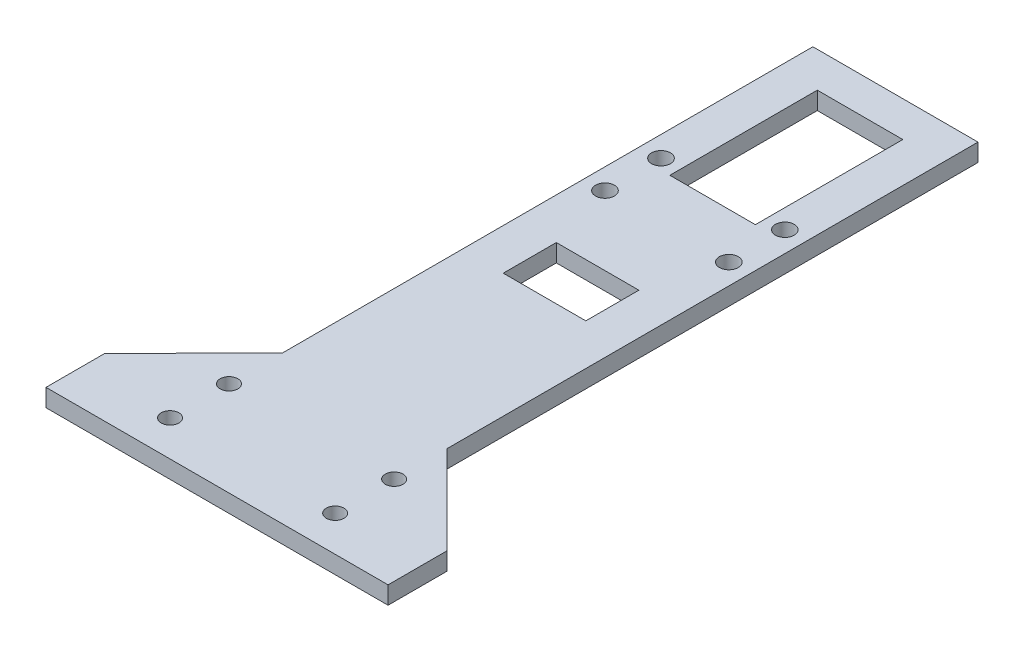
ISO-10303-21;
HEADER;
FILE_DESCRIPTION(('STEP AP214'),'2;1');
FILE_NAME('part.step','',(''),(''),'','','');
FILE_SCHEMA(('AUTOMOTIVE_DESIGN { 1 0 10303 214 1 1 1 1 }'));
ENDSEC;
DATA;
#1=APPLICATION_CONTEXT('core data for automotive mechanical design processes');
#2=APPLICATION_PROTOCOL_DEFINITION('international standard','automotive_design',2000,#1);
#3=PRODUCT_CONTEXT('',#1,'mechanical');
#4=PRODUCT('Part','Part','',(#3));
#5=PRODUCT_RELATED_PRODUCT_CATEGORY('part','',(#4));
#6=PRODUCT_DEFINITION_FORMATION('','',#4);
#7=PRODUCT_DEFINITION_CONTEXT('part definition',#1,'design');
#8=PRODUCT_DEFINITION('design','',#6,#7);
#9=PRODUCT_DEFINITION_SHAPE('','',#8);
#10=(LENGTH_UNIT() NAMED_UNIT(*) SI_UNIT(.MILLI.,.METRE.));
#11=(NAMED_UNIT(*) PLANE_ANGLE_UNIT() SI_UNIT($,.RADIAN.));
#12=(NAMED_UNIT(*) SI_UNIT($,.STERADIAN.) SOLID_ANGLE_UNIT());
#13=UNCERTAINTY_MEASURE_WITH_UNIT(LENGTH_MEASURE(1.E-05),#10,'distance_accuracy_value','');
#14=(GEOMETRIC_REPRESENTATION_CONTEXT(3) GLOBAL_UNCERTAINTY_ASSIGNED_CONTEXT((#13)) GLOBAL_UNIT_ASSIGNED_CONTEXT((#10,
#11,#12)) REPRESENTATION_CONTEXT('',''));
#15=CARTESIAN_POINT('',(0.,0.,0.));
#16=DIRECTION('',(0.,0.,1.));
#17=DIRECTION('',(1.,0.,0.));
#18=AXIS2_PLACEMENT_3D('',#15,#16,#17);
#19=CARTESIAN_POINT('',(0.,3.,0.));
#20=DIRECTION('',(0.,-1.,0.));
#21=DIRECTION('',(0.,0.,-1.));
#22=AXIS2_PLACEMENT_3D('',#19,#20,#21);
#23=PLANE('',#22);
#24=CARTESIAN_POINT('',(-24.5,3.,29.25));
#25=DIRECTION('',(0.,1.,0.));
#26=DIRECTION('',(0.,0.,-1.));
#27=AXIS2_PLACEMENT_3D('',#24,#25,#26);
#28=CIRCLE('',#27,1.6);
#29=CARTESIAN_POINT('',(-24.5,3.,27.65));
#30=VERTEX_POINT('',#29);
#31=EDGE_CURVE('E208',#30,#30,#28,.T.);
#32=ORIENTED_EDGE('',*,*,#31,.F.);
#33=EDGE_LOOP('',(#32));
#34=FACE_BOUND('',#33,.T.);
#35=CARTESIAN_POINT('',(-3.49999999999998,3.,29.25));
#36=DIRECTION('',(0.,1.,0.));
#37=DIRECTION('',(0.,0.,1.));
#38=AXIS2_PLACEMENT_3D('',#35,#36,#37);
#39=CIRCLE('',#38,1.6);
#40=CARTESIAN_POINT('',(-3.49999999999998,3.,30.85));
#41=VERTEX_POINT('',#40);
#42=EDGE_CURVE('E216',#41,#41,#39,.T.);
#43=ORIENTED_EDGE('',*,*,#42,.F.);
#44=EDGE_LOOP('',(#43));
#45=FACE_BOUND('',#44,.T.);
#46=CARTESIAN_POINT('',(-3.49999999999998,3.,38.75));
#47=DIRECTION('',(0.,1.,0.));
#48=DIRECTION('',(0.,0.,-1.));
#49=AXIS2_PLACEMENT_3D('',#46,#47,#48);
#50=CIRCLE('',#49,1.6);
#51=CARTESIAN_POINT('',(-3.49999999999998,3.,37.15));
#52=VERTEX_POINT('',#51);
#53=EDGE_CURVE('E224',#52,#52,#50,.T.);
#54=ORIENTED_EDGE('',*,*,#53,.F.);
#55=EDGE_LOOP('',(#54));
#56=FACE_BOUND('',#55,.T.);
#57=CARTESIAN_POINT('',(-24.5,3.,38.75));
#58=DIRECTION('',(0.,1.,0.));
#59=DIRECTION('',(0.,0.,1.));
#60=AXIS2_PLACEMENT_3D('',#57,#58,#59);
#61=CIRCLE('',#60,1.6);
#62=CARTESIAN_POINT('',(-24.5,3.,40.35));
#63=VERTEX_POINT('',#62);
#64=EDGE_CURVE('E232',#63,#63,#61,.T.);
#65=ORIENTED_EDGE('',*,*,#64,.F.);
#66=EDGE_LOOP('',(#65));
#67=FACE_BOUND('',#66,.T.);
#68=DIRECTION('',(0.,0.,1.));
#69=VECTOR('',#68,1.);
#70=CARTESIAN_POINT('',(-21.,3.,50.5));
#71=LINE('',#70,#69);
#72=CARTESIAN_POINT('',(-21.,3.,50.5));
#73=VERTEX_POINT('',#72);
#74=CARTESIAN_POINT('',(-21.,3.,59.5));
#75=VERTEX_POINT('',#74);
#76=EDGE_CURVE('E240',#73,#75,#71,.T.);
#77=ORIENTED_EDGE('',*,*,#76,.F.);
#78=DIRECTION('',(-1.,0.,0.));
#79=VECTOR('',#78,1.);
#80=CARTESIAN_POINT('',(-21.,3.,50.5));
#81=LINE('',#80,#79);
#82=CARTESIAN_POINT('',(-6.99999999999999,3.,50.5));
#83=VERTEX_POINT('',#82);
#84=EDGE_CURVE('E251',#83,#73,#81,.T.);
#85=ORIENTED_EDGE('',*,*,#84,.F.);
#86=DIRECTION('',(0.,0.,-1.));
#87=VECTOR('',#86,1.);
#88=CARTESIAN_POINT('',(-6.99999999999999,3.,50.5));
#89=LINE('',#88,#87);
#90=CARTESIAN_POINT('',(-6.99999999999999,3.,59.5));
#91=VERTEX_POINT('',#90);
#92=EDGE_CURVE('E247',#91,#83,#89,.T.);
#93=ORIENTED_EDGE('',*,*,#92,.F.);
#94=DIRECTION('',(1.,0.,0.));
#95=VECTOR('',#94,1.);
#96=CARTESIAN_POINT('',(-21.,3.,59.5));
#97=LINE('',#96,#95);
#98=EDGE_CURVE('E243',#75,#91,#97,.T.);
#99=ORIENTED_EDGE('',*,*,#98,.F.);
#100=EDGE_LOOP('',(#77,#85,#93,#99));
#101=FACE_BOUND('',#100,.T.);
#102=DIRECTION('',(-1.,0.,0.));
#103=VECTOR('',#102,1.);
#104=CARTESIAN_POINT('',(-28.,3.,0.));
#105=LINE('',#104,#103);
#106=CARTESIAN_POINT('',(0.,3.,0.));
#107=VERTEX_POINT('',#106);
#108=CARTESIAN_POINT('',(-28.,3.,0.));
#109=VERTEX_POINT('',#108);
#110=EDGE_CURVE('E283',#107,#109,#105,.T.);
#111=ORIENTED_EDGE('',*,*,#110,.T.);
#112=DIRECTION('',(0.,0.,1.));
#113=VECTOR('',#112,1.);
#114=CARTESIAN_POINT('',(-28.,3.,0.));
#115=LINE('',#114,#113);
#116=CARTESIAN_POINT('',(-28.,3.,90.));
#117=VERTEX_POINT('',#116);
#118=EDGE_CURVE('E287',#109,#117,#115,.T.);
#119=ORIENTED_EDGE('',*,*,#118,.T.);
#120=DIRECTION('',(-0.706418916717017,0.,0.707793977160272));
#121=VECTOR('',#120,1.);
#122=CARTESIAN_POINT('',(-28.,3.,90.));
#123=LINE('',#122,#121);
#124=CARTESIAN_POINT('',(-43.,3.,105.029197840206));
#125=VERTEX_POINT('',#124);
#126=EDGE_CURVE('E291',#117,#125,#123,.T.);
#127=ORIENTED_EDGE('',*,*,#126,.T.);
#128=DIRECTION('',(0.,0.,1.));
#129=VECTOR('',#128,1.);
#130=CARTESIAN_POINT('',(-43.,3.,105.029197840206));
#131=LINE('',#130,#129);
#132=CARTESIAN_POINT('',(-43.,3.,115.029197840206));
#133=VERTEX_POINT('',#132);
#134=EDGE_CURVE('E294',#125,#133,#131,.T.);
#135=ORIENTED_EDGE('',*,*,#134,.T.);
#136=DIRECTION('',(1.,0.,0.));
#137=VECTOR('',#136,1.);
#138=CARTESIAN_POINT('',(-43.,3.,115.029197840206));
#139=LINE('',#138,#137);
#140=CARTESIAN_POINT('',(15.,3.,115.029197840206));
#141=VERTEX_POINT('',#140);
#142=EDGE_CURVE('E297',#133,#141,#139,.T.);
#143=ORIENTED_EDGE('',*,*,#142,.T.);
#144=DIRECTION('',(0.,0.,-1.));
#145=VECTOR('',#144,1.);
#146=CARTESIAN_POINT('',(15.,3.,115.029197840206));
#147=LINE('',#146,#145);
#148=CARTESIAN_POINT('',(15.,3.,105.029197840206));
#149=VERTEX_POINT('',#148);
#150=EDGE_CURVE('E300',#141,#149,#147,.T.);
#151=ORIENTED_EDGE('',*,*,#150,.T.);
#152=DIRECTION('',(-0.706418916717017,0.,-0.707793977160272));
#153=VECTOR('',#152,1.);
#154=CARTESIAN_POINT('',(0.,3.,90.));
#155=LINE('',#154,#153);
#156=CARTESIAN_POINT('',(0.,3.,90.));
#157=VERTEX_POINT('',#156);
#158=EDGE_CURVE('E303',#149,#157,#155,.T.);
#159=ORIENTED_EDGE('',*,*,#158,.T.);
#160=DIRECTION('',(0.,0.,-1.));
#161=VECTOR('',#160,1.);
#162=CARTESIAN_POINT('',(0.,3.,0.));
#163=LINE('',#162,#161);
#164=EDGE_CURVE('E306',#157,#107,#163,.T.);
#165=ORIENTED_EDGE('',*,*,#164,.T.);
#166=EDGE_LOOP('',(#111,#119,#127,#135,#143,#151,#159,#165));
#167=FACE_BOUND('',#166,.T.);
#168=DIRECTION('',(0.,0.,1.));
#169=VECTOR('',#168,1.);
#170=CARTESIAN_POINT('',(-21.25,3.,6.));
#171=LINE('',#170,#169);
#172=CARTESIAN_POINT('',(-21.25,3.,6.));
#173=VERTEX_POINT('',#172);
#174=CARTESIAN_POINT('',(-21.25,3.,31.));
#175=VERTEX_POINT('',#174);
#176=EDGE_CURVE('E157',#173,#175,#171,.T.);
#177=ORIENTED_EDGE('',*,*,#176,.F.);
#178=DIRECTION('',(-1.,0.,0.));
#179=VECTOR('',#178,1.);
#180=CARTESIAN_POINT('',(-21.25,3.,6.));
#181=LINE('',#180,#179);
#182=CARTESIAN_POINT('',(-6.75,3.,6.));
#183=VERTEX_POINT('',#182);
#184=EDGE_CURVE('E184',#183,#173,#181,.T.);
#185=ORIENTED_EDGE('',*,*,#184,.F.);
#186=DIRECTION('',(0.,0.,-1.));
#187=VECTOR('',#186,1.);
#188=CARTESIAN_POINT('',(-6.75,3.,6.));
#189=LINE('',#188,#187);
#190=CARTESIAN_POINT('',(-6.75,3.,31.));
#191=VERTEX_POINT('',#190);
#192=EDGE_CURVE('E180',#191,#183,#189,.T.);
#193=ORIENTED_EDGE('',*,*,#192,.F.);
#194=DIRECTION('',(1.,0.,0.));
#195=VECTOR('',#194,1.);
#196=CARTESIAN_POINT('',(-21.25,3.,31.));
#197=LINE('',#196,#195);
#198=EDGE_CURVE('E166',#175,#191,#197,.T.);
#199=ORIENTED_EDGE('',*,*,#198,.F.);
#200=EDGE_LOOP('',(#177,#185,#193,#199));
#201=FACE_BOUND('',#200,.T.);
#202=CARTESIAN_POINT('',(-28.,3.,99.));
#203=DIRECTION('',(0.,1.,0.));
#204=DIRECTION('',(0.,0.,1.));
#205=AXIS2_PLACEMENT_3D('',#202,#203,#204);
#206=CIRCLE('',#205,1.5);
#207=CARTESIAN_POINT('',(-28.,3.,100.5));
#208=VERTEX_POINT('',#207);
#209=EDGE_CURVE('E192',#208,#208,#206,.T.);
#210=ORIENTED_EDGE('',*,*,#209,.F.);
#211=EDGE_LOOP('',(#210));
#212=FACE_BOUND('',#211,.T.);
#213=CARTESIAN_POINT('',(0.,3.,99.));
#214=DIRECTION('',(0.,1.,0.));
#215=DIRECTION('',(0.,0.,1.));
#216=AXIS2_PLACEMENT_3D('',#213,#214,#215);
#217=CIRCLE('',#216,1.5);
#218=CARTESIAN_POINT('',(0.,3.,100.5));
#219=VERTEX_POINT('',#218);
#220=EDGE_CURVE('E518',#219,#219,#217,.T.);
#221=ORIENTED_EDGE('',*,*,#220,.F.);
#222=EDGE_LOOP('',(#221));
#223=FACE_BOUND('',#222,.T.);
#224=CARTESIAN_POINT('',(-28.,3.,109.));
#225=DIRECTION('',(0.,1.,0.));
#226=DIRECTION('',(0.,0.,1.));
#227=AXIS2_PLACEMENT_3D('',#224,#225,#226);
#228=CIRCLE('',#227,1.5);
#229=CARTESIAN_POINT('',(-28.,3.,110.5));
#230=VERTEX_POINT('',#229);
#231=EDGE_CURVE('E510',#230,#230,#228,.T.);
#232=ORIENTED_EDGE('',*,*,#231,.F.);
#233=EDGE_LOOP('',(#232));
#234=FACE_BOUND('',#233,.T.);
#235=CARTESIAN_POINT('',(0.,3.,109.));
#236=DIRECTION('',(0.,1.,0.));
#237=DIRECTION('',(0.,0.,1.));
#238=AXIS2_PLACEMENT_3D('',#235,#236,#237);
#239=CIRCLE('',#238,1.5);
#240=CARTESIAN_POINT('',(0.,3.,110.5));
#241=VERTEX_POINT('',#240);
#242=EDGE_CURVE('E499',#241,#241,#239,.T.);
#243=ORIENTED_EDGE('',*,*,#242,.F.);
#244=EDGE_LOOP('',(#243));
#245=FACE_BOUND('',#244,.T.);
#246=ADVANCED_FACE('F43',(#34,#45,#56,#67,#101,#167,#201,#212,#223,#234,#245),#23,.F.);
#247=CARTESIAN_POINT('',(0.,0.,0.));
#248=DIRECTION('',(0.,-1.,0.));
#249=DIRECTION('',(0.,0.,-1.));
#250=AXIS2_PLACEMENT_3D('',#247,#248,#249);
#251=PLANE('',#250);
#252=CARTESIAN_POINT('',(-28.,0.,109.));
#253=DIRECTION('',(0.,1.,0.));
#254=DIRECTION('',(0.,0.,1.));
#255=AXIS2_PLACEMENT_3D('',#252,#253,#254);
#256=CIRCLE('',#255,1.5);
#257=CARTESIAN_POINT('',(-28.,0.,110.5));
#258=VERTEX_POINT('',#257);
#259=EDGE_CURVE('E507',#258,#258,#256,.T.);
#260=ORIENTED_EDGE('',*,*,#259,.T.);
#261=EDGE_LOOP('',(#260));
#262=FACE_BOUND('',#261,.T.);
#263=CARTESIAN_POINT('',(-28.,0.,99.));
#264=DIRECTION('',(0.,1.,0.));
#265=DIRECTION('',(0.,0.,1.));
#266=AXIS2_PLACEMENT_3D('',#263,#264,#265);
#267=CIRCLE('',#266,1.5);
#268=CARTESIAN_POINT('',(-28.,0.,100.5));
#269=VERTEX_POINT('',#268);
#270=EDGE_CURVE('E522',#269,#269,#267,.T.);
#271=ORIENTED_EDGE('',*,*,#270,.T.);
#272=EDGE_LOOP('',(#271));
#273=FACE_BOUND('',#272,.T.);
#274=CARTESIAN_POINT('',(-3.49999999999998,0.,29.25));
#275=DIRECTION('',(0.,1.,0.));
#276=DIRECTION('',(0.,0.,1.));
#277=AXIS2_PLACEMENT_3D('',#274,#275,#276);
#278=CIRCLE('',#277,1.6);
#279=CARTESIAN_POINT('',(-3.49999999999998,0.,30.85));
#280=VERTEX_POINT('',#279);
#281=EDGE_CURVE('E212',#280,#280,#278,.T.);
#282=ORIENTED_EDGE('',*,*,#281,.T.);
#283=EDGE_LOOP('',(#282));
#284=FACE_BOUND('',#283,.T.);
#285=CARTESIAN_POINT('',(-24.5,0.,38.75));
#286=DIRECTION('',(0.,1.,0.));
#287=DIRECTION('',(0.,0.,1.));
#288=AXIS2_PLACEMENT_3D('',#285,#286,#287);
#289=CIRCLE('',#288,1.6);
#290=CARTESIAN_POINT('',(-24.5,0.,40.35));
#291=VERTEX_POINT('',#290);
#292=EDGE_CURVE('E228',#291,#291,#289,.T.);
#293=ORIENTED_EDGE('',*,*,#292,.T.);
#294=EDGE_LOOP('',(#293));
#295=FACE_BOUND('',#294,.T.);
#296=DIRECTION('',(-1.,0.,0.));
#297=VECTOR('',#296,1.);
#298=CARTESIAN_POINT('',(-28.,0.,0.));
#299=LINE('',#298,#297);
#300=CARTESIAN_POINT('',(0.,0.,0.));
#301=VERTEX_POINT('',#300);
#302=CARTESIAN_POINT('',(-28.,0.,0.));
#303=VERTEX_POINT('',#302);
#304=EDGE_CURVE('E282',#301,#303,#299,.T.);
#305=ORIENTED_EDGE('',*,*,#304,.F.);
#306=DIRECTION('',(0.,0.,-1.));
#307=VECTOR('',#306,1.);
#308=CARTESIAN_POINT('',(0.,0.,0.));
#309=LINE('',#308,#307);
#310=CARTESIAN_POINT('',(0.,0.,90.));
#311=VERTEX_POINT('',#310);
#312=EDGE_CURVE('E288',#311,#301,#309,.T.);
#313=ORIENTED_EDGE('',*,*,#312,.F.);
#314=DIRECTION('',(-0.706418916717017,0.,-0.707793977160272));
#315=VECTOR('',#314,1.);
#316=CARTESIAN_POINT('',(0.,0.,90.));
#317=LINE('',#316,#315);
#318=CARTESIAN_POINT('',(15.,0.,105.029197840206));
#319=VERTEX_POINT('',#318);
#320=EDGE_CURVE('E328',#319,#311,#317,.T.);
#321=ORIENTED_EDGE('',*,*,#320,.F.);
#322=DIRECTION('',(0.,0.,-1.));
#323=VECTOR('',#322,1.);
#324=CARTESIAN_POINT('',(15.,0.,115.029197840206));
#325=LINE('',#324,#323);
#326=CARTESIAN_POINT('',(15.,0.,115.029197840206));
#327=VERTEX_POINT('',#326);
#328=EDGE_CURVE('E325',#327,#319,#325,.T.);
#329=ORIENTED_EDGE('',*,*,#328,.F.);
#330=DIRECTION('',(1.,0.,0.));
#331=VECTOR('',#330,1.);
#332=CARTESIAN_POINT('',(-43.,0.,115.029197840206));
#333=LINE('',#332,#331);
#334=CARTESIAN_POINT('',(-43.,0.,115.029197840206));
#335=VERTEX_POINT('',#334);
#336=EDGE_CURVE('E322',#335,#327,#333,.T.);
#337=ORIENTED_EDGE('',*,*,#336,.F.);
#338=DIRECTION('',(0.,0.,1.));
#339=VECTOR('',#338,1.);
#340=CARTESIAN_POINT('',(-43.,0.,105.029197840206));
#341=LINE('',#340,#339);
#342=CARTESIAN_POINT('',(-43.,0.,105.029197840206));
#343=VERTEX_POINT('',#342);
#344=EDGE_CURVE('E319',#343,#335,#341,.T.);
#345=ORIENTED_EDGE('',*,*,#344,.F.);
#346=DIRECTION('',(-0.706418916717017,0.,0.707793977160272));
#347=VECTOR('',#346,1.);
#348=CARTESIAN_POINT('',(-28.,0.,90.));
#349=LINE('',#348,#347);
#350=CARTESIAN_POINT('',(-28.,0.,90.));
#351=VERTEX_POINT('',#350);
#352=EDGE_CURVE('E316',#351,#343,#349,.T.);
#353=ORIENTED_EDGE('',*,*,#352,.F.);
#354=DIRECTION('',(0.,0.,1.));
#355=VECTOR('',#354,1.);
#356=CARTESIAN_POINT('',(-28.,0.,0.));
#357=LINE('',#356,#355);
#358=EDGE_CURVE('E313',#303,#351,#357,.T.);
#359=ORIENTED_EDGE('',*,*,#358,.F.);
#360=EDGE_LOOP('',(#305,#313,#321,#329,#337,#345,#353,#359));
#361=FACE_BOUND('',#360,.T.);
#362=DIRECTION('',(-1.,0.,0.));
#363=VECTOR('',#362,1.);
#364=CARTESIAN_POINT('',(-21.,0.,50.5));
#365=LINE('',#364,#363);
#366=CARTESIAN_POINT('',(-6.99999999999999,0.,50.5));
#367=VERTEX_POINT('',#366);
#368=CARTESIAN_POINT('',(-21.,0.,50.5));
#369=VERTEX_POINT('',#368);
#370=EDGE_CURVE('E244',#367,#369,#365,.T.);
#371=ORIENTED_EDGE('',*,*,#370,.T.);
#372=DIRECTION('',(0.,0.,1.));
#373=VECTOR('',#372,1.);
#374=CARTESIAN_POINT('',(-21.,0.,50.5));
#375=LINE('',#374,#373);
#376=CARTESIAN_POINT('',(-21.,0.,59.5));
#377=VERTEX_POINT('',#376);
#378=EDGE_CURVE('E236',#369,#377,#375,.T.);
#379=ORIENTED_EDGE('',*,*,#378,.T.);
#380=DIRECTION('',(1.,0.,0.));
#381=VECTOR('',#380,1.);
#382=CARTESIAN_POINT('',(-21.,0.,59.5));
#383=LINE('',#382,#381);
#384=CARTESIAN_POINT('',(-6.99999999999999,0.,59.5));
#385=VERTEX_POINT('',#384);
#386=EDGE_CURVE('E258',#377,#385,#383,.T.);
#387=ORIENTED_EDGE('',*,*,#386,.T.);
#388=DIRECTION('',(0.,0.,-1.));
#389=VECTOR('',#388,1.);
#390=CARTESIAN_POINT('',(-6.99999999999999,0.,50.5));
#391=LINE('',#390,#389);
#392=EDGE_CURVE('E262',#385,#367,#391,.T.);
#393=ORIENTED_EDGE('',*,*,#392,.T.);
#394=EDGE_LOOP('',(#371,#379,#387,#393));
#395=FACE_BOUND('',#394,.T.);
#396=CARTESIAN_POINT('',(-3.49999999999998,0.,38.75));
#397=DIRECTION('',(0.,1.,0.));
#398=DIRECTION('',(0.,0.,-1.));
#399=AXIS2_PLACEMENT_3D('',#396,#397,#398);
#400=CIRCLE('',#399,1.6);
#401=CARTESIAN_POINT('',(-3.49999999999998,0.,37.15));
#402=VERTEX_POINT('',#401);
#403=EDGE_CURVE('E220',#402,#402,#400,.T.);
#404=ORIENTED_EDGE('',*,*,#403,.T.);
#405=EDGE_LOOP('',(#404));
#406=FACE_BOUND('',#405,.T.);
#407=CARTESIAN_POINT('',(-24.5,0.,29.25));
#408=DIRECTION('',(0.,1.,0.));
#409=DIRECTION('',(0.,0.,-1.));
#410=AXIS2_PLACEMENT_3D('',#407,#408,#409);
#411=CIRCLE('',#410,1.6);
#412=CARTESIAN_POINT('',(-24.5,0.,27.65));
#413=VERTEX_POINT('',#412);
#414=EDGE_CURVE('E175',#413,#413,#411,.T.);
#415=ORIENTED_EDGE('',*,*,#414,.T.);
#416=EDGE_LOOP('',(#415));
#417=FACE_BOUND('',#416,.T.);
#418=DIRECTION('',(-1.,0.,0.));
#419=VECTOR('',#418,1.);
#420=CARTESIAN_POINT('',(-21.25,0.,6.));
#421=LINE('',#420,#419);
#422=CARTESIAN_POINT('',(-6.75,0.,6.));
#423=VERTEX_POINT('',#422);
#424=CARTESIAN_POINT('',(-21.25,0.,6.));
#425=VERTEX_POINT('',#424);
#426=EDGE_CURVE('E167',#423,#425,#421,.T.);
#427=ORIENTED_EDGE('',*,*,#426,.T.);
#428=DIRECTION('',(0.,0.,1.));
#429=VECTOR('',#428,1.);
#430=CARTESIAN_POINT('',(-21.25,0.,6.));
#431=LINE('',#430,#429);
#432=CARTESIAN_POINT('',(-21.25,0.,31.));
#433=VERTEX_POINT('',#432);
#434=EDGE_CURVE('E67',#425,#433,#431,.T.);
#435=ORIENTED_EDGE('',*,*,#434,.T.);
#436=DIRECTION('',(1.,0.,0.));
#437=VECTOR('',#436,1.);
#438=CARTESIAN_POINT('',(-21.25,0.,31.));
#439=LINE('',#438,#437);
#440=CARTESIAN_POINT('',(-6.75,0.,31.));
#441=VERTEX_POINT('',#440);
#442=EDGE_CURVE('E173',#433,#441,#439,.T.);
#443=ORIENTED_EDGE('',*,*,#442,.T.);
#444=DIRECTION('',(0.,0.,-1.));
#445=VECTOR('',#444,1.);
#446=CARTESIAN_POINT('',(-6.75,0.,6.));
#447=LINE('',#446,#445);
#448=EDGE_CURVE('E195',#441,#423,#447,.T.);
#449=ORIENTED_EDGE('',*,*,#448,.T.);
#450=EDGE_LOOP('',(#427,#435,#443,#449));
#451=FACE_BOUND('',#450,.T.);
#452=CARTESIAN_POINT('',(0.,0.,99.));
#453=DIRECTION('',(0.,1.,0.));
#454=DIRECTION('',(0.,0.,1.));
#455=AXIS2_PLACEMENT_3D('',#452,#453,#454);
#456=CIRCLE('',#455,1.5);
#457=CARTESIAN_POINT('',(0.,0.,100.5));
#458=VERTEX_POINT('',#457);
#459=EDGE_CURVE('E514',#458,#458,#456,.T.);
#460=ORIENTED_EDGE('',*,*,#459,.T.);
#461=EDGE_LOOP('',(#460));
#462=FACE_BOUND('',#461,.T.);
#463=CARTESIAN_POINT('',(0.,0.,109.));
#464=DIRECTION('',(0.,1.,0.));
#465=DIRECTION('',(0.,0.,1.));
#466=AXIS2_PLACEMENT_3D('',#463,#464,#465);
#467=CIRCLE('',#466,1.5);
#468=CARTESIAN_POINT('',(0.,0.,110.5));
#469=VERTEX_POINT('',#468);
#470=EDGE_CURVE('E502',#469,#469,#467,.T.);
#471=ORIENTED_EDGE('',*,*,#470,.T.);
#472=EDGE_LOOP('',(#471));
#473=FACE_BOUND('',#472,.T.);
#474=ADVANCED_FACE('F367',(#262,#273,#284,#295,#361,#395,#406,#417,#451,#462,#473),#251,.T.);
#475=CARTESIAN_POINT('',(-28.,3.,0.));
#476=DIRECTION('',(0.,0.,1.));
#477=DIRECTION('',(1.,0.,0.));
#478=AXIS2_PLACEMENT_3D('',#475,#476,#477);
#479=PLANE('',#478);
#480=ORIENTED_EDGE('',*,*,#304,.T.);
#481=DIRECTION('',(0.,-1.,0.));
#482=VECTOR('',#481,1.);
#483=CARTESIAN_POINT('',(-28.,3.,0.));
#484=LINE('',#483,#482);
#485=EDGE_CURVE('E11',#109,#303,#484,.T.);
#486=ORIENTED_EDGE('',*,*,#485,.F.);
#487=ORIENTED_EDGE('',*,*,#110,.F.);
#488=DIRECTION('',(0.,-1.,0.));
#489=VECTOR('',#488,1.);
#490=CARTESIAN_POINT('',(0.,3.,0.));
#491=LINE('',#490,#489);
#492=EDGE_CURVE('E309',#107,#301,#491,.T.);
#493=ORIENTED_EDGE('',*,*,#492,.T.);
#494=EDGE_LOOP('',(#480,#486,#487,#493));
#495=FACE_BOUND('',#494,.T.);
#496=ADVANCED_FACE('F45',(#495),#479,.F.);
#497=CARTESIAN_POINT('',(-28.,3.,0.));
#498=DIRECTION('',(1.,0.,0.));
#499=DIRECTION('',(0.,0.,-1.));
#500=AXIS2_PLACEMENT_3D('',#497,#498,#499);
#501=PLANE('',#500);
#502=ORIENTED_EDGE('',*,*,#358,.T.);
#503=DIRECTION('',(0.,-1.,0.));
#504=VECTOR('',#503,1.);
#505=CARTESIAN_POINT('',(-28.,3.,90.));
#506=LINE('',#505,#504);
#507=EDGE_CURVE('E52',#117,#351,#506,.T.);
#508=ORIENTED_EDGE('',*,*,#507,.F.);
#509=ORIENTED_EDGE('',*,*,#118,.F.);
#510=ORIENTED_EDGE('',*,*,#485,.T.);
#511=EDGE_LOOP('',(#502,#508,#509,#510));
#512=FACE_BOUND('',#511,.T.);
#513=ADVANCED_FACE('F384',(#512),#501,.F.);
#514=CARTESIAN_POINT('',(-28.,3.,90.));
#515=DIRECTION('',(0.707793977160272,0.,0.706418916717017));
#516=DIRECTION('',(0.706418916717017,0.,-0.707793977160272));
#517=AXIS2_PLACEMENT_3D('',#514,#515,#516);
#518=PLANE('',#517);
#519=ORIENTED_EDGE('',*,*,#352,.T.);
#520=DIRECTION('',(0.,-1.,0.));
#521=VECTOR('',#520,1.);
#522=CARTESIAN_POINT('',(-43.,3.,105.029197840206));
#523=LINE('',#522,#521);
#524=EDGE_CURVE('E352',#125,#343,#523,.T.);
#525=ORIENTED_EDGE('',*,*,#524,.F.);
#526=ORIENTED_EDGE('',*,*,#126,.F.);
#527=ORIENTED_EDGE('',*,*,#507,.T.);
#528=EDGE_LOOP('',(#519,#525,#526,#527));
#529=FACE_BOUND('',#528,.T.);
#530=ADVANCED_FACE('F361',(#529),#518,.F.);
#531=CARTESIAN_POINT('',(-43.,3.,105.029197840206));
#532=DIRECTION('',(1.,0.,0.));
#533=DIRECTION('',(0.,0.,-1.));
#534=AXIS2_PLACEMENT_3D('',#531,#532,#533);
#535=PLANE('',#534);
#536=ORIENTED_EDGE('',*,*,#344,.T.);
#537=DIRECTION('',(0.,-1.,0.));
#538=VECTOR('',#537,1.);
#539=CARTESIAN_POINT('',(-43.,3.,115.029197840206));
#540=LINE('',#539,#538);
#541=EDGE_CURVE('E348',#133,#335,#540,.T.);
#542=ORIENTED_EDGE('',*,*,#541,.F.);
#543=ORIENTED_EDGE('',*,*,#134,.F.);
#544=ORIENTED_EDGE('',*,*,#524,.T.);
#545=EDGE_LOOP('',(#536,#542,#543,#544));
#546=FACE_BOUND('',#545,.T.);
#547=ADVANCED_FACE('F373',(#546),#535,.F.);
#548=CARTESIAN_POINT('',(-43.,3.,115.029197840206));
#549=DIRECTION('',(0.,0.,-1.));
#550=DIRECTION('',(-1.,0.,0.));
#551=AXIS2_PLACEMENT_3D('',#548,#549,#550);
#552=PLANE('',#551);
#553=ORIENTED_EDGE('',*,*,#336,.T.);
#554=DIRECTION('',(0.,-1.,0.));
#555=VECTOR('',#554,1.);
#556=CARTESIAN_POINT('',(15.,3.,115.029197840206));
#557=LINE('',#556,#555);
#558=EDGE_CURVE('E344',#141,#327,#557,.T.);
#559=ORIENTED_EDGE('',*,*,#558,.F.);
#560=ORIENTED_EDGE('',*,*,#142,.F.);
#561=ORIENTED_EDGE('',*,*,#541,.T.);
#562=EDGE_LOOP('',(#553,#559,#560,#561));
#563=FACE_BOUND('',#562,.T.);
#564=ADVANCED_FACE('F377',(#563),#552,.F.);
#565=CARTESIAN_POINT('',(15.,3.,115.029197840206));
#566=DIRECTION('',(-1.,0.,0.));
#567=DIRECTION('',(0.,0.,1.));
#568=AXIS2_PLACEMENT_3D('',#565,#566,#567);
#569=PLANE('',#568);
#570=ORIENTED_EDGE('',*,*,#328,.T.);
#571=DIRECTION('',(0.,-1.,0.));
#572=VECTOR('',#571,1.);
#573=CARTESIAN_POINT('',(15.,3.,105.029197840206));
#574=LINE('',#573,#572);
#575=EDGE_CURVE('E340',#149,#319,#574,.T.);
#576=ORIENTED_EDGE('',*,*,#575,.F.);
#577=ORIENTED_EDGE('',*,*,#150,.F.);
#578=ORIENTED_EDGE('',*,*,#558,.T.);
#579=EDGE_LOOP('',(#570,#576,#577,#578));
#580=FACE_BOUND('',#579,.T.);
#581=ADVANCED_FACE('F397',(#580),#569,.F.);
#582=CARTESIAN_POINT('',(0.,3.,90.));
#583=DIRECTION('',(-0.707793977160272,0.,0.706418916717017));
#584=DIRECTION('',(0.706418916717017,0.,0.707793977160272));
#585=AXIS2_PLACEMENT_3D('',#582,#583,#584);
#586=PLANE('',#585);
#587=ORIENTED_EDGE('',*,*,#320,.T.);
#588=DIRECTION('',(0.,-1.,0.));
#589=VECTOR('',#588,1.);
#590=CARTESIAN_POINT('',(0.,3.,90.));
#591=LINE('',#590,#589);
#592=EDGE_CURVE('E336',#157,#311,#591,.T.);
#593=ORIENTED_EDGE('',*,*,#592,.F.);
#594=ORIENTED_EDGE('',*,*,#158,.F.);
#595=ORIENTED_EDGE('',*,*,#575,.T.);
#596=EDGE_LOOP('',(#587,#593,#594,#595));
#597=FACE_BOUND('',#596,.T.);
#598=ADVANCED_FACE('F395',(#597),#586,.F.);
#599=CARTESIAN_POINT('',(0.,3.,0.));
#600=DIRECTION('',(-1.,0.,0.));
#601=DIRECTION('',(0.,0.,1.));
#602=AXIS2_PLACEMENT_3D('',#599,#600,#601);
#603=PLANE('',#602);
#604=ORIENTED_EDGE('',*,*,#312,.T.);
#605=ORIENTED_EDGE('',*,*,#492,.F.);
#606=ORIENTED_EDGE('',*,*,#164,.F.);
#607=ORIENTED_EDGE('',*,*,#592,.T.);
#608=EDGE_LOOP('',(#604,#605,#606,#607));
#609=FACE_BOUND('',#608,.T.);
#610=ADVANCED_FACE('F390',(#609),#603,.F.);
#611=CARTESIAN_POINT('',(-21.,3.,50.5));
#612=DIRECTION('',(1.,0.,0.));
#613=DIRECTION('',(0.,0.,-1.));
#614=AXIS2_PLACEMENT_3D('',#611,#612,#613);
#615=PLANE('',#614);
#616=ORIENTED_EDGE('',*,*,#378,.F.);
#617=DIRECTION('',(0.,-1.,0.));
#618=VECTOR('',#617,1.);
#619=CARTESIAN_POINT('',(-21.,3.,50.5));
#620=LINE('',#619,#618);
#621=EDGE_CURVE('E254',#73,#369,#620,.T.);
#622=ORIENTED_EDGE('',*,*,#621,.F.);
#623=ORIENTED_EDGE('',*,*,#76,.T.);
#624=DIRECTION('',(0.,-1.,0.));
#625=VECTOR('',#624,1.);
#626=CARTESIAN_POINT('',(-21.,3.,59.5));
#627=LINE('',#626,#625);
#628=EDGE_CURVE('E278',#75,#377,#627,.T.);
#629=ORIENTED_EDGE('',*,*,#628,.T.);
#630=EDGE_LOOP('',(#616,#622,#623,#629));
#631=FACE_BOUND('',#630,.T.);
#632=ADVANCED_FACE('F417',(#631),#615,.T.);
#633=CARTESIAN_POINT('',(-21.,3.,59.5));
#634=DIRECTION('',(0.,0.,-1.));
#635=DIRECTION('',(-1.,0.,0.));
#636=AXIS2_PLACEMENT_3D('',#633,#634,#635);
#637=PLANE('',#636);
#638=ORIENTED_EDGE('',*,*,#386,.F.);
#639=ORIENTED_EDGE('',*,*,#628,.F.);
#640=ORIENTED_EDGE('',*,*,#98,.T.);
#641=DIRECTION('',(0.,-1.,0.));
#642=VECTOR('',#641,1.);
#643=CARTESIAN_POINT('',(-6.99999999999999,3.,59.5));
#644=LINE('',#643,#642);
#645=EDGE_CURVE('E275',#91,#385,#644,.T.);
#646=ORIENTED_EDGE('',*,*,#645,.T.);
#647=EDGE_LOOP('',(#638,#639,#640,#646));
#648=FACE_BOUND('',#647,.T.);
#649=ADVANCED_FACE('F424',(#648),#637,.T.);
#650=CARTESIAN_POINT('',(-6.99999999999999,3.,50.5));
#651=DIRECTION('',(-1.,0.,0.));
#652=DIRECTION('',(0.,0.,1.));
#653=AXIS2_PLACEMENT_3D('',#650,#651,#652);
#654=PLANE('',#653);
#655=ORIENTED_EDGE('',*,*,#392,.F.);
#656=ORIENTED_EDGE('',*,*,#645,.F.);
#657=ORIENTED_EDGE('',*,*,#92,.T.);
#658=DIRECTION('',(0.,-1.,0.));
#659=VECTOR('',#658,1.);
#660=CARTESIAN_POINT('',(-6.99999999999999,3.,50.5));
#661=LINE('',#660,#659);
#662=EDGE_CURVE('E272',#83,#367,#661,.T.);
#663=ORIENTED_EDGE('',*,*,#662,.T.);
#664=EDGE_LOOP('',(#655,#656,#657,#663));
#665=FACE_BOUND('',#664,.T.);
#666=ADVANCED_FACE('F429',(#665),#654,.T.);
#667=CARTESIAN_POINT('',(-21.,3.,50.5));
#668=DIRECTION('',(0.,0.,1.));
#669=DIRECTION('',(1.,0.,0.));
#670=AXIS2_PLACEMENT_3D('',#667,#668,#669);
#671=PLANE('',#670);
#672=ORIENTED_EDGE('',*,*,#370,.F.);
#673=ORIENTED_EDGE('',*,*,#662,.F.);
#674=ORIENTED_EDGE('',*,*,#84,.T.);
#675=ORIENTED_EDGE('',*,*,#621,.T.);
#676=EDGE_LOOP('',(#672,#673,#674,#675));
#677=FACE_BOUND('',#676,.T.);
#678=ADVANCED_FACE('F436',(#677),#671,.T.);
#679=CARTESIAN_POINT('',(-24.5,3.,38.75));
#680=DIRECTION('',(0.,-1.,0.));
#681=DIRECTION('',(0.,0.,-1.));
#682=AXIS2_PLACEMENT_3D('',#679,#680,#681);
#683=CYLINDRICAL_SURFACE('',#682,1.6);
#684=ORIENTED_EDGE('',*,*,#64,.T.);
#685=EDGE_LOOP('',(#684));
#686=FACE_BOUND('',#685,.T.);
#687=ORIENTED_EDGE('',*,*,#292,.F.);
#688=EDGE_LOOP('',(#687));
#689=FACE_BOUND('',#688,.T.);
#690=ADVANCED_FACE('F450',(#686,#689),#683,.F.);
#691=CARTESIAN_POINT('',(-3.49999999999998,3.,38.75));
#692=DIRECTION('',(0.,-1.,0.));
#693=DIRECTION('',(0.,0.,-1.));
#694=AXIS2_PLACEMENT_3D('',#691,#692,#693);
#695=CYLINDRICAL_SURFACE('',#694,1.6);
#696=ORIENTED_EDGE('',*,*,#53,.T.);
#697=EDGE_LOOP('',(#696));
#698=FACE_BOUND('',#697,.T.);
#699=ORIENTED_EDGE('',*,*,#403,.F.);
#700=EDGE_LOOP('',(#699));
#701=FACE_BOUND('',#700,.T.);
#702=ADVANCED_FACE('F455',(#698,#701),#695,.F.);
#703=CARTESIAN_POINT('',(-3.49999999999998,3.,29.25));
#704=DIRECTION('',(0.,-1.,0.));
#705=DIRECTION('',(0.,0.,-1.));
#706=AXIS2_PLACEMENT_3D('',#703,#704,#705);
#707=CYLINDRICAL_SURFACE('',#706,1.6);
#708=ORIENTED_EDGE('',*,*,#42,.T.);
#709=EDGE_LOOP('',(#708));
#710=FACE_BOUND('',#709,.T.);
#711=ORIENTED_EDGE('',*,*,#281,.F.);
#712=EDGE_LOOP('',(#711));
#713=FACE_BOUND('',#712,.T.);
#714=ADVANCED_FACE('F459',(#710,#713),#707,.F.);
#715=CARTESIAN_POINT('',(-24.5,3.,29.25));
#716=DIRECTION('',(0.,-1.,0.));
#717=DIRECTION('',(0.,0.,-1.));
#718=AXIS2_PLACEMENT_3D('',#715,#716,#717);
#719=CYLINDRICAL_SURFACE('',#718,1.6);
#720=ORIENTED_EDGE('',*,*,#31,.T.);
#721=EDGE_LOOP('',(#720));
#722=FACE_BOUND('',#721,.T.);
#723=ORIENTED_EDGE('',*,*,#414,.F.);
#724=EDGE_LOOP('',(#723));
#725=FACE_BOUND('',#724,.T.);
#726=ADVANCED_FACE('F463',(#722,#725),#719,.F.);
#727=CARTESIAN_POINT('',(-21.25,3.,6.));
#728=DIRECTION('',(1.,0.,0.));
#729=DIRECTION('',(0.,0.,-1.));
#730=AXIS2_PLACEMENT_3D('',#727,#728,#729);
#731=PLANE('',#730);
#732=ORIENTED_EDGE('',*,*,#434,.F.);
#733=DIRECTION('',(0.,-1.,0.));
#734=VECTOR('',#733,1.);
#735=CARTESIAN_POINT('',(-21.25,3.,6.));
#736=LINE('',#735,#734);
#737=EDGE_CURVE('E161',#173,#425,#736,.T.);
#738=ORIENTED_EDGE('',*,*,#737,.F.);
#739=ORIENTED_EDGE('',*,*,#176,.T.);
#740=DIRECTION('',(0.,-1.,0.));
#741=VECTOR('',#740,1.);
#742=CARTESIAN_POINT('',(-21.25,3.,31.));
#743=LINE('',#742,#741);
#744=EDGE_CURVE('E160',#175,#433,#743,.T.);
#745=ORIENTED_EDGE('',*,*,#744,.T.);
#746=EDGE_LOOP('',(#732,#738,#739,#745));
#747=FACE_BOUND('',#746,.T.);
#748=ADVANCED_FACE('F159',(#747),#731,.T.);
#749=CARTESIAN_POINT('',(-21.25,3.,31.));
#750=DIRECTION('',(0.,0.,-1.));
#751=DIRECTION('',(-1.,0.,0.));
#752=AXIS2_PLACEMENT_3D('',#749,#750,#751);
#753=PLANE('',#752);
#754=ORIENTED_EDGE('',*,*,#442,.F.);
#755=ORIENTED_EDGE('',*,*,#744,.F.);
#756=ORIENTED_EDGE('',*,*,#198,.T.);
#757=DIRECTION('',(0.,-1.,0.));
#758=VECTOR('',#757,1.);
#759=CARTESIAN_POINT('',(-6.75,3.,31.));
#760=LINE('',#759,#758);
#761=EDGE_CURVE('E176',#191,#441,#760,.T.);
#762=ORIENTED_EDGE('',*,*,#761,.T.);
#763=EDGE_LOOP('',(#754,#755,#756,#762));
#764=FACE_BOUND('',#763,.T.);
#765=ADVANCED_FACE('F170',(#764),#753,.T.);
#766=CARTESIAN_POINT('',(-6.75,3.,6.));
#767=DIRECTION('',(-1.,0.,0.));
#768=DIRECTION('',(0.,0.,1.));
#769=AXIS2_PLACEMENT_3D('',#766,#767,#768);
#770=PLANE('',#769);
#771=ORIENTED_EDGE('',*,*,#448,.F.);
#772=ORIENTED_EDGE('',*,*,#761,.F.);
#773=ORIENTED_EDGE('',*,*,#192,.T.);
#774=DIRECTION('',(0.,-1.,0.));
#775=VECTOR('',#774,1.);
#776=CARTESIAN_POINT('',(-6.75,3.,6.));
#777=LINE('',#776,#775);
#778=EDGE_CURVE('E59',#183,#423,#777,.T.);
#779=ORIENTED_EDGE('',*,*,#778,.T.);
#780=EDGE_LOOP('',(#771,#772,#773,#779));
#781=FACE_BOUND('',#780,.T.);
#782=ADVANCED_FACE('F472',(#781),#770,.T.);
#783=CARTESIAN_POINT('',(-21.25,3.,6.));
#784=DIRECTION('',(0.,0.,1.));
#785=DIRECTION('',(1.,0.,0.));
#786=AXIS2_PLACEMENT_3D('',#783,#784,#785);
#787=PLANE('',#786);
#788=ORIENTED_EDGE('',*,*,#426,.F.);
#789=ORIENTED_EDGE('',*,*,#778,.F.);
#790=ORIENTED_EDGE('',*,*,#184,.T.);
#791=ORIENTED_EDGE('',*,*,#737,.T.);
#792=EDGE_LOOP('',(#788,#789,#790,#791));
#793=FACE_BOUND('',#792,.T.);
#794=ADVANCED_FACE('F475',(#793),#787,.T.);
#795=CARTESIAN_POINT('',(-28.,3.,99.));
#796=DIRECTION('',(0.,-1.,0.));
#797=DIRECTION('',(0.,0.,-1.));
#798=AXIS2_PLACEMENT_3D('',#795,#796,#797);
#799=CYLINDRICAL_SURFACE('',#798,1.5);
#800=ORIENTED_EDGE('',*,*,#209,.T.);
#801=EDGE_LOOP('',(#800));
#802=FACE_BOUND('',#801,.T.);
#803=ORIENTED_EDGE('',*,*,#270,.F.);
#804=EDGE_LOOP('',(#803));
#805=FACE_BOUND('',#804,.T.);
#806=ADVANCED_FACE('F479',(#802,#805),#799,.F.);
#807=CARTESIAN_POINT('',(0.,3.,99.));
#808=DIRECTION('',(0.,-1.,0.));
#809=DIRECTION('',(0.,0.,-1.));
#810=AXIS2_PLACEMENT_3D('',#807,#808,#809);
#811=CYLINDRICAL_SURFACE('',#810,1.5);
#812=ORIENTED_EDGE('',*,*,#220,.T.);
#813=EDGE_LOOP('',(#812));
#814=FACE_BOUND('',#813,.T.);
#815=ORIENTED_EDGE('',*,*,#459,.F.);
#816=EDGE_LOOP('',(#815));
#817=FACE_BOUND('',#816,.T.);
#818=ADVANCED_FACE('F482',(#814,#817),#811,.F.);
#819=CARTESIAN_POINT('',(-28.,3.,109.));
#820=DIRECTION('',(0.,-1.,0.));
#821=DIRECTION('',(0.,0.,-1.));
#822=AXIS2_PLACEMENT_3D('',#819,#820,#821);
#823=CYLINDRICAL_SURFACE('',#822,1.5);
#824=ORIENTED_EDGE('',*,*,#231,.T.);
#825=EDGE_LOOP('',(#824));
#826=FACE_BOUND('',#825,.T.);
#827=ORIENTED_EDGE('',*,*,#259,.F.);
#828=EDGE_LOOP('',(#827));
#829=FACE_BOUND('',#828,.T.);
#830=ADVANCED_FACE('F486',(#826,#829),#823,.F.);
#831=CARTESIAN_POINT('',(0.,3.,109.));
#832=DIRECTION('',(0.,-1.,0.));
#833=DIRECTION('',(0.,0.,-1.));
#834=AXIS2_PLACEMENT_3D('',#831,#832,#833);
#835=CYLINDRICAL_SURFACE('',#834,1.5);
#836=ORIENTED_EDGE('',*,*,#242,.T.);
#837=EDGE_LOOP('',(#836));
#838=FACE_BOUND('',#837,.T.);
#839=ORIENTED_EDGE('',*,*,#470,.F.);
#840=EDGE_LOOP('',(#839));
#841=FACE_BOUND('',#840,.T.);
#842=ADVANCED_FACE('F490',(#838,#841),#835,.F.);
#843=CLOSED_SHELL('',(#246,#474,#496,#513,#530,#547,#564,#581,#598,#610,#632,#649,#666,#678,
#690,#702,#714,#726,#748,#765,#782,#794,#806,#818,#830,#842));
#844=MANIFOLD_SOLID_BREP('B2',#843);
#845=ADVANCED_BREP_SHAPE_REPRESENTATION('',(#18,#844),#14);
#846=SHAPE_DEFINITION_REPRESENTATION(#9,#845);
ENDSEC;
END-ISO-10303-21;
